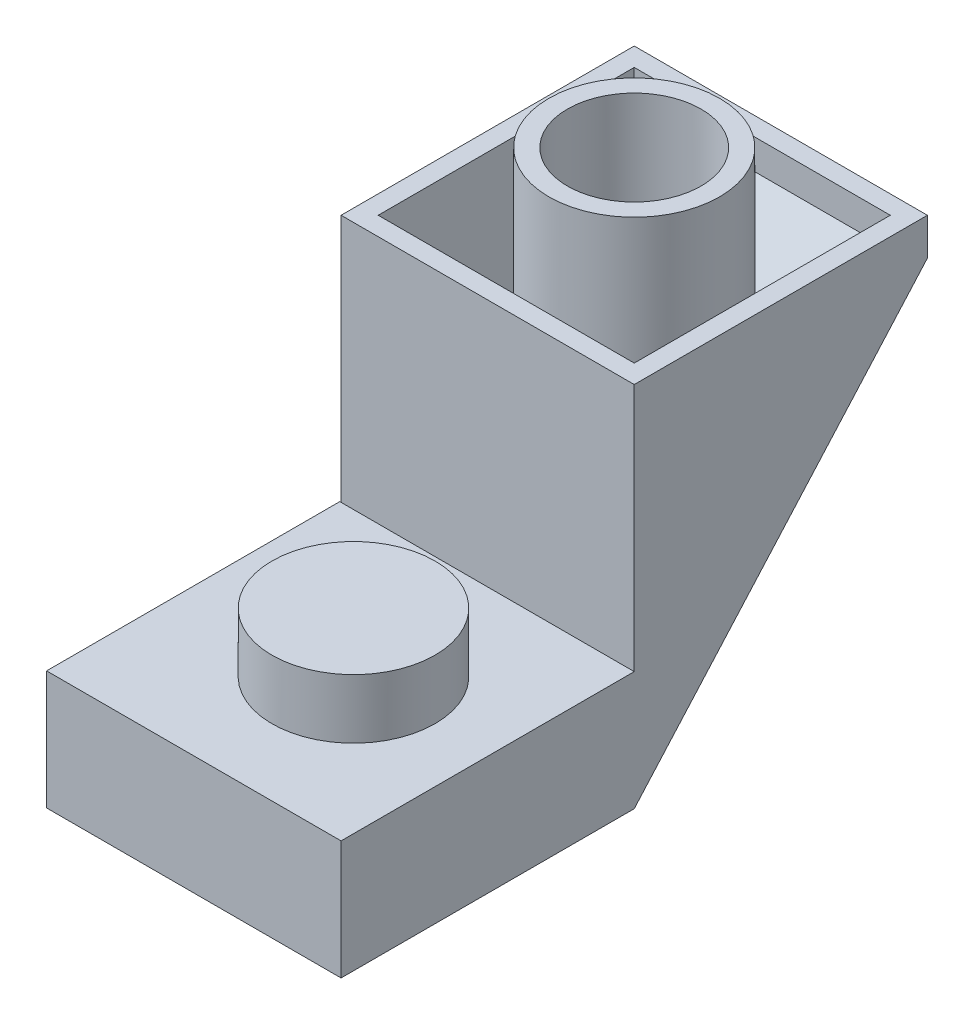
ISO-10303-21;
HEADER;
FILE_DESCRIPTION(('STEP AP214'),'2;1');
FILE_NAME('part.step','',(''),(''),'','','');
FILE_SCHEMA(('AUTOMOTIVE_DESIGN { 1 0 10303 214 1 1 1 1 }'));
ENDSEC;
DATA;
#1=APPLICATION_CONTEXT('core data for automotive mechanical design processes');
#2=APPLICATION_PROTOCOL_DEFINITION('international standard','automotive_design',2000,#1);
#3=PRODUCT_CONTEXT('',#1,'mechanical');
#4=PRODUCT('Part','Part','',(#3));
#5=PRODUCT_RELATED_PRODUCT_CATEGORY('part','',(#4));
#6=PRODUCT_DEFINITION_FORMATION('','',#4);
#7=PRODUCT_DEFINITION_CONTEXT('part definition',#1,'design');
#8=PRODUCT_DEFINITION('design','',#6,#7);
#9=PRODUCT_DEFINITION_SHAPE('','',#8);
#10=(LENGTH_UNIT() NAMED_UNIT(*) SI_UNIT(.MILLI.,.METRE.));
#11=(NAMED_UNIT(*) PLANE_ANGLE_UNIT() SI_UNIT($,.RADIAN.));
#12=(NAMED_UNIT(*) SI_UNIT($,.STERADIAN.) SOLID_ANGLE_UNIT());
#13=UNCERTAINTY_MEASURE_WITH_UNIT(LENGTH_MEASURE(1.E-05),#10,'distance_accuracy_value','');
#14=(GEOMETRIC_REPRESENTATION_CONTEXT(3) GLOBAL_UNCERTAINTY_ASSIGNED_CONTEXT((#13)) GLOBAL_UNIT_ASSIGNED_CONTEXT((#10,
#11,#12)) REPRESENTATION_CONTEXT('',''));
#15=CARTESIAN_POINT('',(0.,0.,0.));
#16=DIRECTION('',(0.,0.,1.));
#17=DIRECTION('',(1.,0.,0.));
#18=AXIS2_PLACEMENT_3D('',#15,#16,#17);
#19=CARTESIAN_POINT('',(-12.8193653307459,9.9,-7.9));
#20=DIRECTION('',(0.,1.,0.));
#21=DIRECTION('',(-1.,0.,0.));
#22=AXIS2_PLACEMENT_3D('',#19,#20,#21);
#23=PLANE('',#22);
#24=DIRECTION('',(0.,0.,1.));
#25=VECTOR('',#24,1.);
#26=CARTESIAN_POINT('',(-4.9193653307459,9.9,-7.9));
#27=LINE('',#26,#25);
#28=CARTESIAN_POINT('',(-4.9193653307459,9.9,-15.8));
#29=VERTEX_POINT('',#28);
#30=CARTESIAN_POINT('',(-4.9193653307459,9.9,-7.9));
#31=VERTEX_POINT('',#30);
#32=EDGE_CURVE('E369',#29,#31,#27,.T.);
#33=ORIENTED_EDGE('',*,*,#32,.F.);
#34=DIRECTION('',(1.,0.,0.));
#35=VECTOR('',#34,1.);
#36=CARTESIAN_POINT('',(-12.8193653307459,9.9,-15.8));
#37=LINE('',#36,#35);
#38=CARTESIAN_POINT('',(-12.8193653307459,9.9,-15.8));
#39=VERTEX_POINT('',#38);
#40=EDGE_CURVE('E377',#39,#29,#37,.T.);
#41=ORIENTED_EDGE('',*,*,#40,.F.);
#42=DIRECTION('',(0.,0.,1.));
#43=VECTOR('',#42,1.);
#44=CARTESIAN_POINT('',(-12.8193653307459,9.9,-7.9));
#45=LINE('',#44,#43);
#46=CARTESIAN_POINT('',(-12.8193653307459,9.9,-7.9));
#47=VERTEX_POINT('',#46);
#48=EDGE_CURVE('E360',#39,#47,#45,.T.);
#49=ORIENTED_EDGE('',*,*,#48,.T.);
#50=DIRECTION('',(1.,0.,0.));
#51=VECTOR('',#50,1.);
#52=CARTESIAN_POINT('',(-12.8193653307459,9.9,-7.9));
#53=LINE('',#52,#51);
#54=EDGE_CURVE('E374',#47,#31,#53,.T.);
#55=ORIENTED_EDGE('',*,*,#54,.T.);
#56=EDGE_LOOP('',(#33,#41,#49,#55));
#57=FACE_BOUND('',#56,.T.);
#58=DIRECTION('',(1.,0.,0.));
#59=VECTOR('',#58,1.);
#60=CARTESIAN_POINT('',(-12.8193653307459,9.9,-15.3));
#61=LINE('',#60,#59);
#62=CARTESIAN_POINT('',(-12.3193653307459,9.9,-15.3));
#63=VERTEX_POINT('',#62);
#64=CARTESIAN_POINT('',(-5.4193653307459,9.9,-15.3));
#65=VERTEX_POINT('',#64);
#66=EDGE_CURVE('E329',#63,#65,#61,.T.);
#67=ORIENTED_EDGE('',*,*,#66,.T.);
#68=DIRECTION('',(0.,0.,1.));
#69=VECTOR('',#68,1.);
#70=CARTESIAN_POINT('',(-5.4193653307459,9.9,-7.9));
#71=LINE('',#70,#69);
#72=CARTESIAN_POINT('',(-5.4193653307459,9.9,-8.4));
#73=VERTEX_POINT('',#72);
#74=EDGE_CURVE('E317',#65,#73,#71,.T.);
#75=ORIENTED_EDGE('',*,*,#74,.T.);
#76=DIRECTION('',(1.,0.,0.));
#77=VECTOR('',#76,1.);
#78=CARTESIAN_POINT('',(-12.8193653307459,9.9,-8.4));
#79=LINE('',#78,#77);
#80=CARTESIAN_POINT('',(-12.3193653307459,9.9,-8.4));
#81=VERTEX_POINT('',#80);
#82=EDGE_CURVE('E335',#81,#73,#79,.T.);
#83=ORIENTED_EDGE('',*,*,#82,.F.);
#84=DIRECTION('',(0.,0.,1.));
#85=VECTOR('',#84,1.);
#86=CARTESIAN_POINT('',(-12.3193653307459,9.9,-7.9));
#87=LINE('',#86,#85);
#88=EDGE_CURVE('E70',#63,#81,#87,.T.);
#89=ORIENTED_EDGE('',*,*,#88,.F.);
#90=EDGE_LOOP('',(#67,#75,#83,#89));
#91=FACE_BOUND('',#90,.T.);
#92=ADVANCED_FACE('F55',(#57,#91),#23,.T.);
#93=CARTESIAN_POINT('',(2.11527093596059,2.,-1.2));
#94=DIRECTION('',(0.,0.,-1.));
#95=DIRECTION('',(-1.,0.,0.));
#96=AXIS2_PLACEMENT_3D('',#93,#94,#95);
#97=PLANE('',#96);
#98=DIRECTION('',(1.,0.,0.));
#99=VECTOR('',#98,1.);
#100=CARTESIAN_POINT('',(2.11527093596059,2.,-1.2));
#101=LINE('',#100,#99);
#102=CARTESIAN_POINT('',(-11.2847290640394,2.,-1.2));
#103=VERTEX_POINT('',#102);
#104=CARTESIAN_POINT('',(-6.1193653307459,2.,-1.2));
#105=VERTEX_POINT('',#104);
#106=EDGE_CURVE('E415',#103,#105,#101,.T.);
#107=ORIENTED_EDGE('',*,*,#106,.T.);
#108=DIRECTION('',(0.,-1.,0.));
#109=VECTOR('',#108,1.);
#110=CARTESIAN_POINT('',(-6.1193653307459,2.,-1.2));
#111=LINE('',#110,#109);
#112=CARTESIAN_POINT('',(-6.1193653307459,0.,-1.2));
#113=VERTEX_POINT('',#112);
#114=EDGE_CURVE('E384',#105,#113,#111,.T.);
#115=ORIENTED_EDGE('',*,*,#114,.T.);
#116=DIRECTION('',(1.,0.,0.));
#117=VECTOR('',#116,1.);
#118=CARTESIAN_POINT('',(2.11527093596059,0.,-1.2));
#119=LINE('',#118,#117);
#120=CARTESIAN_POINT('',(-11.2847290640394,0.,-1.2));
#121=VERTEX_POINT('',#120);
#122=EDGE_CURVE('E420',#121,#113,#119,.T.);
#123=ORIENTED_EDGE('',*,*,#122,.F.);
#124=DIRECTION('',(0.,-1.,0.));
#125=VECTOR('',#124,1.);
#126=CARTESIAN_POINT('',(-11.2847290640394,2.,-1.2));
#127=LINE('',#126,#125);
#128=EDGE_CURVE('E412',#103,#121,#127,.T.);
#129=ORIENTED_EDGE('',*,*,#128,.F.);
#130=EDGE_LOOP('',(#107,#115,#123,#129));
#131=FACE_BOUND('',#130,.T.);
#132=ADVANCED_FACE('F57',(#131),#97,.T.);
#133=CARTESIAN_POINT('',(-11.2847290640394,3.2,7.9));
#134=DIRECTION('',(1.,0.,0.));
#135=DIRECTION('',(0.,0.,-1.));
#136=AXIS2_PLACEMENT_3D('',#133,#134,#135);
#137=PLANE('',#136);
#138=DIRECTION('',(0.,0.,-1.));
#139=VECTOR('',#138,1.);
#140=CARTESIAN_POINT('',(-11.2847290640394,2.,7.9));
#141=LINE('',#140,#139);
#142=CARTESIAN_POINT('',(-11.2847290640394,2.,-6.7));
#143=VERTEX_POINT('',#142);
#144=EDGE_CURVE('E425',#103,#143,#141,.T.);
#145=ORIENTED_EDGE('',*,*,#144,.F.);
#146=ORIENTED_EDGE('',*,*,#128,.T.);
#147=DIRECTION('',(0.,0.,-1.));
#148=VECTOR('',#147,1.);
#149=CARTESIAN_POINT('',(-11.2847290640394,0.,7.9));
#150=LINE('',#149,#148);
#151=CARTESIAN_POINT('',(-11.2847290640394,0.,-6.7));
#152=VERTEX_POINT('',#151);
#153=EDGE_CURVE('E436',#121,#152,#150,.T.);
#154=ORIENTED_EDGE('',*,*,#153,.T.);
#155=DIRECTION('',(0.,-1.,0.));
#156=VECTOR('',#155,1.);
#157=CARTESIAN_POINT('',(-11.2847290640394,3.2,-6.7));
#158=LINE('',#157,#156);
#159=EDGE_CURVE('E424',#143,#152,#158,.T.);
#160=ORIENTED_EDGE('',*,*,#159,.F.);
#161=EDGE_LOOP('',(#145,#146,#154,#160));
#162=FACE_BOUND('',#161,.T.);
#163=ADVANCED_FACE('F514',(#162),#137,.T.);
#164=CARTESIAN_POINT('',(0.,0.,-7.9));
#165=DIRECTION('',(0.,0.,1.));
#166=DIRECTION('',(1.,0.,0.));
#167=AXIS2_PLACEMENT_3D('',#164,#165,#166);
#168=PLANE('',#167);
#169=DIRECTION('',(-1.,0.,0.));
#170=VECTOR('',#169,1.);
#171=CARTESIAN_POINT('',(3.31527093596059,3.2,-7.9));
#172=LINE('',#171,#170);
#173=CARTESIAN_POINT('',(-12.8193653307459,3.2,-7.9));
#174=VERTEX_POINT('',#173);
#175=CARTESIAN_POINT('',(-12.8547290640394,3.2,-7.9));
#176=VERTEX_POINT('',#175);
#177=EDGE_CURVE('E445',#174,#176,#172,.T.);
#178=ORIENTED_EDGE('',*,*,#177,.F.);
#179=DIRECTION('',(0.,-1.,0.));
#180=VECTOR('',#179,1.);
#181=CARTESIAN_POINT('',(-12.8193653307459,0.,-7.9));
#182=LINE('',#181,#180);
#183=CARTESIAN_POINT('',(-12.8193653307459,0.,-7.9));
#184=VERTEX_POINT('',#183);
#185=EDGE_CURVE('E63',#174,#184,#182,.T.);
#186=ORIENTED_EDGE('',*,*,#185,.T.);
#187=DIRECTION('',(1.,0.,0.));
#188=VECTOR('',#187,1.);
#189=CARTESIAN_POINT('',(-12.4847290640394,0.,-7.9));
#190=LINE('',#189,#188);
#191=CARTESIAN_POINT('',(-12.8547290640394,0.,-7.9));
#192=VERTEX_POINT('',#191);
#193=EDGE_CURVE('E419',#192,#184,#190,.T.);
#194=ORIENTED_EDGE('',*,*,#193,.F.);
#195=DIRECTION('',(0.,1.,0.));
#196=VECTOR('',#195,1.);
#197=CARTESIAN_POINT('',(-12.8547290640394,0.,-7.9));
#198=LINE('',#197,#196);
#199=EDGE_CURVE('E393',#192,#176,#198,.T.);
#200=ORIENTED_EDGE('',*,*,#199,.T.);
#201=EDGE_LOOP('',(#178,#186,#194,#200));
#202=FACE_BOUND('',#201,.T.);
#203=ADVANCED_FACE('F459',(#202),#168,.F.);
#204=CARTESIAN_POINT('',(-12.4847290640394,0.,7.9));
#205=DIRECTION('',(0.,1.,0.));
#206=DIRECTION('',(0.,0.,1.));
#207=AXIS2_PLACEMENT_3D('',#204,#205,#206);
#208=PLANE('',#207);
#209=ORIENTED_EDGE('',*,*,#193,.T.);
#210=DIRECTION('',(1.,0.,0.));
#211=VECTOR('',#210,1.);
#212=CARTESIAN_POINT('',(-12.8193653307459,0.,-7.9));
#213=LINE('',#212,#211);
#214=CARTESIAN_POINT('',(-4.9193653307459,0.,-7.9));
#215=VERTEX_POINT('',#214);
#216=EDGE_CURVE('E363',#184,#215,#213,.T.);
#217=ORIENTED_EDGE('',*,*,#216,.T.);
#218=DIRECTION('',(0.,0.,1.));
#219=VECTOR('',#218,1.);
#220=CARTESIAN_POINT('',(-4.9193653307459,0.,7.9));
#221=LINE('',#220,#219);
#222=CARTESIAN_POINT('',(-4.9193653307459,0.,0.));
#223=VERTEX_POINT('',#222);
#224=EDGE_CURVE('E407',#215,#223,#221,.T.);
#225=ORIENTED_EDGE('',*,*,#224,.T.);
#226=DIRECTION('',(-1.,0.,0.));
#227=VECTOR('',#226,1.);
#228=CARTESIAN_POINT('',(-12.4847290640394,0.,0.));
#229=LINE('',#228,#227);
#230=CARTESIAN_POINT('',(-12.8547290640394,0.,0.));
#231=VERTEX_POINT('',#230);
#232=EDGE_CURVE('E417',#223,#231,#229,.T.);
#233=ORIENTED_EDGE('',*,*,#232,.T.);
#234=DIRECTION('',(0.,0.,1.));
#235=VECTOR('',#234,1.);
#236=CARTESIAN_POINT('',(-12.8547290640394,0.,-7.9));
#237=LINE('',#236,#235);
#238=EDGE_CURVE('E390',#192,#231,#237,.T.);
#239=ORIENTED_EDGE('',*,*,#238,.F.);
#240=EDGE_LOOP('',(#209,#217,#225,#233,#239));
#241=FACE_BOUND('',#240,.T.);
#242=DIRECTION('',(0.,0.,-1.));
#243=VECTOR('',#242,1.);
#244=CARTESIAN_POINT('',(-6.11936533074589,0.,-6.7));
#245=LINE('',#244,#243);
#246=CARTESIAN_POINT('',(-6.11936533074589,0.,-6.7));
#247=VERTEX_POINT('',#246);
#248=EDGE_CURVE('E385',#113,#247,#245,.T.);
#249=ORIENTED_EDGE('',*,*,#248,.T.);
#250=DIRECTION('',(1.,0.,0.));
#251=VECTOR('',#250,1.);
#252=CARTESIAN_POINT('',(-12.4847290640394,0.,-6.7));
#253=LINE('',#252,#251);
#254=EDGE_CURVE('E428',#152,#247,#253,.T.);
#255=ORIENTED_EDGE('',*,*,#254,.F.);
#256=ORIENTED_EDGE('',*,*,#153,.F.);
#257=ORIENTED_EDGE('',*,*,#122,.T.);
#258=EDGE_LOOP('',(#249,#255,#256,#257));
#259=FACE_BOUND('',#258,.T.);
#260=ADVANCED_FACE('F462',(#241,#259),#208,.F.);
#261=CARTESIAN_POINT('',(3.31527093596059,3.2,7.9));
#262=DIRECTION('',(0.,-1.,0.));
#263=DIRECTION('',(1.,0.,0.));
#264=AXIS2_PLACEMENT_3D('',#261,#262,#263);
#265=PLANE('',#264);
#266=DIRECTION('',(0.,0.,-1.));
#267=VECTOR('',#266,1.);
#268=CARTESIAN_POINT('',(-4.9193653307459,3.2,7.9));
#269=LINE('',#268,#267);
#270=CARTESIAN_POINT('',(-4.9193653307459,3.2,0.));
#271=VERTEX_POINT('',#270);
#272=CARTESIAN_POINT('',(-4.9193653307459,3.2,-7.9));
#273=VERTEX_POINT('',#272);
#274=EDGE_CURVE('E409',#271,#273,#269,.T.);
#275=ORIENTED_EDGE('',*,*,#274,.T.);
#276=EDGE_CURVE('E446',#273,#174,#172,.T.);
#277=ORIENTED_EDGE('',*,*,#276,.T.);
#278=ORIENTED_EDGE('',*,*,#177,.T.);
#279=DIRECTION('',(0.,0.,1.));
#280=VECTOR('',#279,1.);
#281=CARTESIAN_POINT('',(-12.8547290640394,3.2,-7.9));
#282=LINE('',#281,#280);
#283=CARTESIAN_POINT('',(-12.8547290640394,3.2,0.));
#284=VERTEX_POINT('',#283);
#285=EDGE_CURVE('E396',#176,#284,#282,.T.);
#286=ORIENTED_EDGE('',*,*,#285,.T.);
#287=DIRECTION('',(-1.,0.,0.));
#288=VECTOR('',#287,1.);
#289=CARTESIAN_POINT('',(-12.4847290640394,3.2,0.));
#290=LINE('',#289,#288);
#291=EDGE_CURVE('E413',#271,#284,#290,.T.);
#292=ORIENTED_EDGE('',*,*,#291,.F.);
#293=EDGE_LOOP('',(#275,#277,#278,#286,#292));
#294=FACE_BOUND('',#293,.T.);
#295=CARTESIAN_POINT('',(-8.58472906403941,3.2,-4.));
#296=DIRECTION('',(0.,-1.,0.));
#297=DIRECTION('',(1.,0.,0.));
#298=AXIS2_PLACEMENT_3D('',#295,#296,#297);
#299=CIRCLE('',#298,2.19793866498286);
#300=CARTESIAN_POINT('',(-6.38679039905655,3.2,-4.));
#301=VERTEX_POINT('',#300);
#302=EDGE_CURVE('E442',#301,#301,#299,.F.);
#303=ORIENTED_EDGE('',*,*,#302,.F.);
#304=EDGE_LOOP('',(#303));
#305=FACE_BOUND('',#304,.T.);
#306=ADVANCED_FACE('F473',(#294,#305),#265,.F.);
#307=CARTESIAN_POINT('',(-8.58472906403941,4.8,-4.));
#308=DIRECTION('',(0.,-1.,0.));
#309=DIRECTION('',(1.,0.,0.));
#310=AXIS2_PLACEMENT_3D('',#307,#308,#309);
#311=CYLINDRICAL_SURFACE('',#310,2.19793866498286);
#312=CARTESIAN_POINT('',(-8.58472906403941,4.8,-4.));
#313=DIRECTION('',(0.,1.,0.));
#314=DIRECTION('',(-1.,0.,0.));
#315=AXIS2_PLACEMENT_3D('',#312,#313,#314);
#316=CIRCLE('',#315,2.19793866498286);
#317=CARTESIAN_POINT('',(-10.7826677290223,4.8,-4.));
#318=VERTEX_POINT('',#317);
#319=EDGE_CURVE('E431',#318,#318,#316,.T.);
#320=ORIENTED_EDGE('',*,*,#319,.F.);
#321=EDGE_LOOP('',(#320));
#322=FACE_BOUND('',#321,.T.);
#323=ORIENTED_EDGE('',*,*,#302,.T.);
#324=EDGE_LOOP('',(#323));
#325=FACE_BOUND('',#324,.T.);
#326=ADVANCED_FACE('F583',(#322,#325),#311,.T.);
#327=CARTESIAN_POINT('',(-8.58472906403941,4.8,-4.));
#328=DIRECTION('',(0.,1.,0.));
#329=DIRECTION('',(-1.,0.,0.));
#330=AXIS2_PLACEMENT_3D('',#327,#328,#329);
#331=PLANE('',#330);
#332=ORIENTED_EDGE('',*,*,#319,.T.);
#333=EDGE_LOOP('',(#332));
#334=FACE_BOUND('',#333,.T.);
#335=ADVANCED_FACE('F542',(#334),#331,.T.);
#336=CARTESIAN_POINT('',(3.31527093596059,2.,7.9));
#337=DIRECTION('',(0.,-1.,0.));
#338=DIRECTION('',(1.,0.,0.));
#339=AXIS2_PLACEMENT_3D('',#336,#337,#338);
#340=PLANE('',#339);
#341=DIRECTION('',(0.,0.,-1.));
#342=VECTOR('',#341,1.);
#343=CARTESIAN_POINT('',(-6.11936533074589,2.,-6.7));
#344=LINE('',#343,#342);
#345=CARTESIAN_POINT('',(-6.11936533074589,2.,-6.7));
#346=VERTEX_POINT('',#345);
#347=EDGE_CURVE('E376',#105,#346,#344,.T.);
#348=ORIENTED_EDGE('',*,*,#347,.F.);
#349=ORIENTED_EDGE('',*,*,#106,.F.);
#350=ORIENTED_EDGE('',*,*,#144,.T.);
#351=DIRECTION('',(-1.,0.,0.));
#352=VECTOR('',#351,1.);
#353=CARTESIAN_POINT('',(3.31527093596059,2.,-6.7));
#354=LINE('',#353,#352);
#355=EDGE_CURVE('E426',#346,#143,#354,.T.);
#356=ORIENTED_EDGE('',*,*,#355,.F.);
#357=EDGE_LOOP('',(#348,#349,#350,#356));
#358=FACE_BOUND('',#357,.T.);
#359=CARTESIAN_POINT('',(-8.58472906403941,2.,-4.));
#360=DIRECTION('',(0.,-1.,0.));
#361=DIRECTION('',(1.,0.,0.));
#362=AXIS2_PLACEMENT_3D('',#359,#360,#361);
#363=CIRCLE('',#362,0.997938664982861);
#364=CARTESIAN_POINT('',(-7.58679039905655,2.,-4.));
#365=VERTEX_POINT('',#364);
#366=EDGE_CURVE('E421',#365,#365,#363,.F.);
#367=ORIENTED_EDGE('',*,*,#366,.T.);
#368=EDGE_LOOP('',(#367));
#369=FACE_BOUND('',#368,.T.);
#370=ADVANCED_FACE('F537',(#358,#369),#340,.T.);
#371=CARTESIAN_POINT('',(0.,0.,-6.7));
#372=DIRECTION('',(0.,0.,1.));
#373=DIRECTION('',(1.,0.,0.));
#374=AXIS2_PLACEMENT_3D('',#371,#372,#373);
#375=PLANE('',#374);
#376=DIRECTION('',(0.,-1.,0.));
#377=VECTOR('',#376,1.);
#378=CARTESIAN_POINT('',(-6.11936533074589,2.,-6.7));
#379=LINE('',#378,#377);
#380=EDGE_CURVE('E387',#346,#247,#379,.T.);
#381=ORIENTED_EDGE('',*,*,#380,.F.);
#382=ORIENTED_EDGE('',*,*,#355,.T.);
#383=ORIENTED_EDGE('',*,*,#159,.T.);
#384=ORIENTED_EDGE('',*,*,#254,.T.);
#385=EDGE_LOOP('',(#381,#382,#383,#384));
#386=FACE_BOUND('',#385,.T.);
#387=ADVANCED_FACE('F541',(#386),#375,.T.);
#388=CARTESIAN_POINT('',(-8.58472906403941,4.8,-4.));
#389=DIRECTION('',(0.,-1.,0.));
#390=DIRECTION('',(1.,0.,0.));
#391=AXIS2_PLACEMENT_3D('',#388,#389,#390);
#392=CYLINDRICAL_SURFACE('',#391,0.997938664982861);
#393=CARTESIAN_POINT('',(-8.58472906403941,3.6,-4.));
#394=DIRECTION('',(0.,1.,0.));
#395=DIRECTION('',(-1.,0.,0.));
#396=AXIS2_PLACEMENT_3D('',#393,#394,#395);
#397=CIRCLE('',#396,0.997938664982861);
#398=CARTESIAN_POINT('',(-9.58266772902228,3.6,-4.));
#399=VERTEX_POINT('',#398);
#400=EDGE_CURVE('E416',#399,#399,#397,.T.);
#401=ORIENTED_EDGE('',*,*,#400,.T.);
#402=EDGE_LOOP('',(#401));
#403=FACE_BOUND('',#402,.T.);
#404=ORIENTED_EDGE('',*,*,#366,.F.);
#405=EDGE_LOOP('',(#404));
#406=FACE_BOUND('',#405,.T.);
#407=ADVANCED_FACE('F503',(#403,#406),#392,.F.);
#408=CARTESIAN_POINT('',(-8.58472906403941,3.6,-4.));
#409=DIRECTION('',(0.,1.,0.));
#410=DIRECTION('',(-1.,0.,0.));
#411=AXIS2_PLACEMENT_3D('',#408,#409,#410);
#412=PLANE('',#411);
#413=ORIENTED_EDGE('',*,*,#400,.F.);
#414=EDGE_LOOP('',(#413));
#415=FACE_BOUND('',#414,.T.);
#416=ADVANCED_FACE('F495',(#415),#412,.F.);
#417=CARTESIAN_POINT('',(-12.4847290640394,-0.386249267544194,0.));
#418=DIRECTION('',(0.,0.,-1.));
#419=DIRECTION('',(-1.,0.,0.));
#420=AXIS2_PLACEMENT_3D('',#417,#418,#419);
#421=PLANE('',#420);
#422=ORIENTED_EDGE('',*,*,#232,.F.);
#423=DIRECTION('',(0.,1.,0.));
#424=VECTOR('',#423,1.);
#425=CARTESIAN_POINT('',(-4.9193653307459,-0.277831155568587,0.));
#426=LINE('',#425,#424);
#427=EDGE_CURVE('E404',#223,#271,#426,.T.);
#428=ORIENTED_EDGE('',*,*,#427,.T.);
#429=ORIENTED_EDGE('',*,*,#291,.T.);
#430=DIRECTION('',(0.,1.,0.));
#431=VECTOR('',#430,1.);
#432=CARTESIAN_POINT('',(-12.8547290640394,0.,0.));
#433=LINE('',#432,#431);
#434=EDGE_CURVE('E401',#231,#284,#433,.T.);
#435=ORIENTED_EDGE('',*,*,#434,.F.);
#436=EDGE_LOOP('',(#422,#428,#429,#435));
#437=FACE_BOUND('',#436,.T.);
#438=ADVANCED_FACE('F493',(#437),#421,.F.);
#439=CARTESIAN_POINT('',(-4.9193653307459,-0.277831155568587,-7.9));
#440=DIRECTION('',(-1.,0.,0.));
#441=DIRECTION('',(0.,-1.,0.));
#442=AXIS2_PLACEMENT_3D('',#439,#440,#441);
#443=PLANE('',#442);
#444=ORIENTED_EDGE('',*,*,#427,.F.);
#445=ORIENTED_EDGE('',*,*,#224,.F.);
#446=DIRECTION('',(0.,0.74787275405863,-0.663842107535188));
#447=VECTOR('',#446,1.);
#448=CARTESIAN_POINT('',(-4.9193653307459,0.,-7.9));
#449=LINE('',#448,#447);
#450=CARTESIAN_POINT('',(-4.9193653307459,8.9,-15.8));
#451=VERTEX_POINT('',#450);
#452=EDGE_CURVE('E345',#215,#451,#449,.T.);
#453=ORIENTED_EDGE('',*,*,#452,.T.);
#454=DIRECTION('',(0.,1.,0.));
#455=VECTOR('',#454,1.);
#456=CARTESIAN_POINT('',(-4.9193653307459,9.9,-15.8));
#457=LINE('',#456,#455);
#458=EDGE_CURVE('E366',#451,#29,#457,.T.);
#459=ORIENTED_EDGE('',*,*,#458,.T.);
#460=ORIENTED_EDGE('',*,*,#32,.T.);
#461=DIRECTION('',(0.,-1.,0.));
#462=VECTOR('',#461,1.);
#463=CARTESIAN_POINT('',(-4.9193653307459,3.2,-7.9));
#464=LINE('',#463,#462);
#465=EDGE_CURVE('E355',#31,#273,#464,.T.);
#466=ORIENTED_EDGE('',*,*,#465,.T.);
#467=ORIENTED_EDGE('',*,*,#274,.F.);
#468=EDGE_LOOP('',(#444,#445,#453,#459,#460,#466,#467));
#469=FACE_BOUND('',#468,.T.);
#470=ADVANCED_FACE('F481',(#469),#443,.F.);
#471=CARTESIAN_POINT('',(-12.8547290640394,0.,-7.9));
#472=DIRECTION('',(-1.,0.,0.));
#473=DIRECTION('',(0.,-1.,0.));
#474=AXIS2_PLACEMENT_3D('',#471,#472,#473);
#475=PLANE('',#474);
#476=ORIENTED_EDGE('',*,*,#434,.T.);
#477=ORIENTED_EDGE('',*,*,#285,.F.);
#478=ORIENTED_EDGE('',*,*,#199,.F.);
#479=ORIENTED_EDGE('',*,*,#238,.T.);
#480=EDGE_LOOP('',(#476,#477,#478,#479));
#481=FACE_BOUND('',#480,.T.);
#482=ADVANCED_FACE('F470',(#481),#475,.T.);
#483=CARTESIAN_POINT('',(-6.11936533074589,2.,-6.7));
#484=DIRECTION('',(-1.,0.,0.));
#485=DIRECTION('',(0.,-1.,0.));
#486=AXIS2_PLACEMENT_3D('',#483,#484,#485);
#487=PLANE('',#486);
#488=ORIENTED_EDGE('',*,*,#380,.T.);
#489=ORIENTED_EDGE('',*,*,#248,.F.);
#490=ORIENTED_EDGE('',*,*,#114,.F.);
#491=ORIENTED_EDGE('',*,*,#347,.T.);
#492=EDGE_LOOP('',(#488,#489,#490,#491));
#493=FACE_BOUND('',#492,.T.);
#494=ADVANCED_FACE('F522',(#493),#487,.T.);
#495=CARTESIAN_POINT('',(-12.8193653307459,3.2,-7.9));
#496=DIRECTION('',(0.,0.,1.));
#497=DIRECTION('',(1.,0.,0.));
#498=AXIS2_PLACEMENT_3D('',#495,#496,#497);
#499=PLANE('',#498);
#500=ORIENTED_EDGE('',*,*,#276,.F.);
#501=ORIENTED_EDGE('',*,*,#465,.F.);
#502=ORIENTED_EDGE('',*,*,#54,.F.);
#503=EDGE_CURVE('E352',#47,#174,#182,.T.);
#504=ORIENTED_EDGE('',*,*,#503,.T.);
#505=EDGE_LOOP('',(#500,#501,#502,#504));
#506=FACE_BOUND('',#505,.T.);
#507=ADVANCED_FACE('F477',(#506),#499,.T.);
#508=CARTESIAN_POINT('',(-12.8193653307459,9.9,-15.8));
#509=DIRECTION('',(0.,0.,-1.));
#510=DIRECTION('',(-1.,0.,0.));
#511=AXIS2_PLACEMENT_3D('',#508,#509,#510);
#512=PLANE('',#511);
#513=ORIENTED_EDGE('',*,*,#458,.F.);
#514=DIRECTION('',(1.,0.,0.));
#515=VECTOR('',#514,1.);
#516=CARTESIAN_POINT('',(-12.8193653307459,8.9,-15.8));
#517=LINE('',#516,#515);
#518=CARTESIAN_POINT('',(-12.8193653307459,8.9,-15.8));
#519=VERTEX_POINT('',#518);
#520=EDGE_CURVE('E379',#519,#451,#517,.T.);
#521=ORIENTED_EDGE('',*,*,#520,.F.);
#522=DIRECTION('',(0.,1.,0.));
#523=VECTOR('',#522,1.);
#524=CARTESIAN_POINT('',(-12.8193653307459,9.9,-15.8));
#525=LINE('',#524,#523);
#526=EDGE_CURVE('E357',#519,#39,#525,.T.);
#527=ORIENTED_EDGE('',*,*,#526,.T.);
#528=ORIENTED_EDGE('',*,*,#40,.T.);
#529=EDGE_LOOP('',(#513,#521,#527,#528));
#530=FACE_BOUND('',#529,.T.);
#531=ADVANCED_FACE('F489',(#530),#512,.T.);
#532=CARTESIAN_POINT('',(-12.8193653307459,0.,-7.9));
#533=DIRECTION('',(0.,-0.663842107535188,-0.74787275405863));
#534=DIRECTION('',(0.,0.74787275405863,-0.663842107535188));
#535=AXIS2_PLACEMENT_3D('',#532,#533,#534);
#536=PLANE('',#535);
#537=ORIENTED_EDGE('',*,*,#452,.F.);
#538=ORIENTED_EDGE('',*,*,#216,.F.);
#539=DIRECTION('',(0.,0.74787275405863,-0.663842107535188));
#540=VECTOR('',#539,1.);
#541=CARTESIAN_POINT('',(-12.8193653307459,0.,-7.9));
#542=LINE('',#541,#540);
#543=EDGE_CURVE('E78',#184,#519,#542,.T.);
#544=ORIENTED_EDGE('',*,*,#543,.T.);
#545=ORIENTED_EDGE('',*,*,#520,.T.);
#546=EDGE_LOOP('',(#537,#538,#544,#545));
#547=FACE_BOUND('',#546,.T.);
#548=ADVANCED_FACE('F491',(#547),#536,.T.);
#549=CARTESIAN_POINT('',(-12.8193653307459,0.,0.));
#550=DIRECTION('',(-1.,0.,0.));
#551=DIRECTION('',(0.,-1.,0.));
#552=AXIS2_PLACEMENT_3D('',#549,#550,#551);
#553=PLANE('',#552);
#554=ORIENTED_EDGE('',*,*,#503,.F.);
#555=ORIENTED_EDGE('',*,*,#48,.F.);
#556=ORIENTED_EDGE('',*,*,#526,.F.);
#557=ORIENTED_EDGE('',*,*,#543,.F.);
#558=ORIENTED_EDGE('',*,*,#185,.F.);
#559=EDGE_LOOP('',(#554,#555,#556,#557,#558));
#560=FACE_BOUND('',#559,.T.);
#561=ADVANCED_FACE('F487',(#560),#553,.T.);
#562=CARTESIAN_POINT('',(2.11527093596059,2.,-0.7));
#563=DIRECTION('',(0.,0.,-1.));
#564=DIRECTION('',(-1.,0.,0.));
#565=AXIS2_PLACEMENT_3D('',#562,#563,#564);
#566=PLANE('',#565);
#567=DIRECTION('',(1.,0.,0.));
#568=VECTOR('',#567,1.);
#569=CARTESIAN_POINT('',(3.31527093596059,2.5,-0.699999999999999));
#570=LINE('',#569,#568);
#571=CARTESIAN_POINT('',(-11.7847290640394,2.5,-0.7));
#572=VERTEX_POINT('',#571);
#573=CARTESIAN_POINT('',(-5.6193653307459,2.5,-0.7));
#574=VERTEX_POINT('',#573);
#575=EDGE_CURVE('E224',#572,#574,#570,.T.);
#576=ORIENTED_EDGE('',*,*,#575,.F.);
#577=DIRECTION('',(0.,-1.,0.));
#578=VECTOR('',#577,1.);
#579=CARTESIAN_POINT('',(-11.7847290640394,2.,-0.7));
#580=LINE('',#579,#578);
#581=CARTESIAN_POINT('',(-11.7847290640394,0.5,-0.7));
#582=VERTEX_POINT('',#581);
#583=EDGE_CURVE('E229',#572,#582,#580,.T.);
#584=ORIENTED_EDGE('',*,*,#583,.T.);
#585=DIRECTION('',(1.,0.,0.));
#586=VECTOR('',#585,1.);
#587=CARTESIAN_POINT('',(2.11527093596059,0.5,-0.7));
#588=LINE('',#587,#586);
#589=CARTESIAN_POINT('',(-5.6193653307459,0.5,-0.7));
#590=VERTEX_POINT('',#589);
#591=EDGE_CURVE('E255',#582,#590,#588,.T.);
#592=ORIENTED_EDGE('',*,*,#591,.T.);
#593=DIRECTION('',(0.,-1.,0.));
#594=VECTOR('',#593,1.);
#595=CARTESIAN_POINT('',(-5.6193653307459,2.,-0.7));
#596=LINE('',#595,#594);
#597=EDGE_CURVE('E232',#574,#590,#596,.T.);
#598=ORIENTED_EDGE('',*,*,#597,.F.);
#599=EDGE_LOOP('',(#576,#584,#592,#598));
#600=FACE_BOUND('',#599,.T.);
#601=ADVANCED_FACE('F226',(#600),#566,.F.);
#602=CARTESIAN_POINT('',(-11.7847290640394,3.2,7.9));
#603=DIRECTION('',(1.,0.,0.));
#604=DIRECTION('',(0.,0.,-1.));
#605=AXIS2_PLACEMENT_3D('',#602,#603,#604);
#606=PLANE('',#605);
#607=DIRECTION('',(0.,0.,-1.));
#608=VECTOR('',#607,1.);
#609=CARTESIAN_POINT('',(-11.7847290640394,2.5,7.9));
#610=LINE('',#609,#608);
#611=CARTESIAN_POINT('',(-11.7847290640394,2.5,-7.2));
#612=VERTEX_POINT('',#611);
#613=EDGE_CURVE('E239',#572,#612,#610,.T.);
#614=ORIENTED_EDGE('',*,*,#613,.T.);
#615=DIRECTION('',(0.,-1.,0.));
#616=VECTOR('',#615,1.);
#617=CARTESIAN_POINT('',(-11.7847290640394,3.2,-7.2));
#618=LINE('',#617,#616);
#619=CARTESIAN_POINT('',(-11.7847290640394,0.5,-7.2));
#620=VERTEX_POINT('',#619);
#621=EDGE_CURVE('E263',#612,#620,#618,.T.);
#622=ORIENTED_EDGE('',*,*,#621,.T.);
#623=DIRECTION('',(0.,0.,-1.));
#624=VECTOR('',#623,1.);
#625=CARTESIAN_POINT('',(-11.7847290640394,0.5,7.9));
#626=LINE('',#625,#624);
#627=EDGE_CURVE('E251',#582,#620,#626,.T.);
#628=ORIENTED_EDGE('',*,*,#627,.F.);
#629=ORIENTED_EDGE('',*,*,#583,.F.);
#630=EDGE_LOOP('',(#614,#622,#628,#629));
#631=FACE_BOUND('',#630,.T.);
#632=ADVANCED_FACE('F250',(#631),#606,.F.);
#633=CARTESIAN_POINT('',(0.,0.,-7.4));
#634=DIRECTION('',(0.,0.,1.));
#635=DIRECTION('',(1.,0.,0.));
#636=AXIS2_PLACEMENT_3D('',#633,#634,#635);
#637=PLANE('',#636);
#638=DIRECTION('',(-1.,0.,0.));
#639=VECTOR('',#638,1.);
#640=CARTESIAN_POINT('',(3.31527093596059,2.7,-7.4));
#641=LINE('',#640,#639);
#642=CARTESIAN_POINT('',(-12.3193653307459,2.7,-7.4));
#643=VERTEX_POINT('',#642);
#644=CARTESIAN_POINT('',(-12.3547290640394,2.7,-7.4));
#645=VERTEX_POINT('',#644);
#646=EDGE_CURVE('E269',#643,#645,#641,.T.);
#647=ORIENTED_EDGE('',*,*,#646,.T.);
#648=DIRECTION('',(0.,1.,0.));
#649=VECTOR('',#648,1.);
#650=CARTESIAN_POINT('',(-12.3547290640394,0.,-7.4));
#651=LINE('',#650,#649);
#652=CARTESIAN_POINT('',(-12.3547290640394,0.5,-7.4));
#653=VERTEX_POINT('',#652);
#654=EDGE_CURVE('E281',#653,#645,#651,.T.);
#655=ORIENTED_EDGE('',*,*,#654,.F.);
#656=DIRECTION('',(1.,0.,0.));
#657=VECTOR('',#656,1.);
#658=CARTESIAN_POINT('',(-12.4847290640394,0.5,-7.4));
#659=LINE('',#658,#657);
#660=CARTESIAN_POINT('',(-12.3193653307459,0.5,-7.4));
#661=VERTEX_POINT('',#660);
#662=EDGE_CURVE('E266',#653,#661,#659,.T.);
#663=ORIENTED_EDGE('',*,*,#662,.T.);
#664=DIRECTION('',(0.,-1.,0.));
#665=VECTOR('',#664,1.);
#666=CARTESIAN_POINT('',(-12.3193653307459,0.,-7.4));
#667=LINE('',#666,#665);
#668=EDGE_CURVE('E235',#643,#661,#667,.T.);
#669=ORIENTED_EDGE('',*,*,#668,.F.);
#670=EDGE_LOOP('',(#647,#655,#663,#669));
#671=FACE_BOUND('',#670,.T.);
#672=ADVANCED_FACE('F631',(#671),#637,.T.);
#673=CARTESIAN_POINT('',(-12.4847290640394,0.5,7.9));
#674=DIRECTION('',(0.,1.,0.));
#675=DIRECTION('',(0.,0.,1.));
#676=AXIS2_PLACEMENT_3D('',#673,#674,#675);
#677=PLANE('',#676);
#678=ORIENTED_EDGE('',*,*,#662,.F.);
#679=DIRECTION('',(0.,0.,1.));
#680=VECTOR('',#679,1.);
#681=CARTESIAN_POINT('',(-12.3547290640394,0.5,7.9));
#682=LINE('',#681,#680);
#683=CARTESIAN_POINT('',(-12.3547290640394,0.5,-0.5));
#684=VERTEX_POINT('',#683);
#685=EDGE_CURVE('E278',#653,#684,#682,.T.);
#686=ORIENTED_EDGE('',*,*,#685,.T.);
#687=DIRECTION('',(-1.,0.,0.));
#688=VECTOR('',#687,1.);
#689=CARTESIAN_POINT('',(-12.4847290640394,0.5,-0.5));
#690=LINE('',#689,#688);
#691=CARTESIAN_POINT('',(-5.4193653307459,0.5,-0.5));
#692=VERTEX_POINT('',#691);
#693=EDGE_CURVE('E270',#692,#684,#690,.T.);
#694=ORIENTED_EDGE('',*,*,#693,.F.);
#695=DIRECTION('',(0.,0.,1.));
#696=VECTOR('',#695,1.);
#697=CARTESIAN_POINT('',(-5.4193653307459,0.5,7.9));
#698=LINE('',#697,#696);
#699=CARTESIAN_POINT('',(-5.4193653307459,0.5,-7.67525729434552));
#700=VERTEX_POINT('',#699);
#701=EDGE_CURVE('E258',#700,#692,#698,.T.);
#702=ORIENTED_EDGE('',*,*,#701,.F.);
#703=DIRECTION('',(1.,0.,0.));
#704=VECTOR('',#703,1.);
#705=CARTESIAN_POINT('',(-12.8193653307459,0.5,-7.67525729434552));
#706=LINE('',#705,#704);
#707=CARTESIAN_POINT('',(-12.3193653307459,0.5,-7.67525729434552));
#708=VERTEX_POINT('',#707);
#709=EDGE_CURVE('E271',#708,#700,#706,.T.);
#710=ORIENTED_EDGE('',*,*,#709,.F.);
#711=DIRECTION('',(0.,0.,-1.));
#712=VECTOR('',#711,1.);
#713=CARTESIAN_POINT('',(-12.3193653307459,0.5,0.));
#714=LINE('',#713,#712);
#715=EDGE_CURVE('E342',#661,#708,#714,.T.);
#716=ORIENTED_EDGE('',*,*,#715,.F.);
#717=EDGE_LOOP('',(#678,#686,#694,#702,#710,#716));
#718=FACE_BOUND('',#717,.T.);
#719=DIRECTION('',(0.,0.,-1.));
#720=VECTOR('',#719,1.);
#721=CARTESIAN_POINT('',(-5.6193653307459,0.5,-6.7));
#722=LINE('',#721,#720);
#723=CARTESIAN_POINT('',(-5.6193653307459,0.5,-7.2));
#724=VERTEX_POINT('',#723);
#725=EDGE_CURVE('E283',#590,#724,#722,.T.);
#726=ORIENTED_EDGE('',*,*,#725,.F.);
#727=ORIENTED_EDGE('',*,*,#591,.F.);
#728=ORIENTED_EDGE('',*,*,#627,.T.);
#729=DIRECTION('',(1.,0.,0.));
#730=VECTOR('',#729,1.);
#731=CARTESIAN_POINT('',(-12.4847290640394,0.5,-7.2));
#732=LINE('',#731,#730);
#733=EDGE_CURVE('E265',#620,#724,#732,.T.);
#734=ORIENTED_EDGE('',*,*,#733,.T.);
#735=EDGE_LOOP('',(#726,#727,#728,#734));
#736=FACE_BOUND('',#735,.T.);
#737=ADVANCED_FACE('F640',(#718,#736),#677,.T.);
#738=CARTESIAN_POINT('',(3.31527093596059,2.7,7.9));
#739=DIRECTION('',(0.,-1.,0.));
#740=DIRECTION('',(1.,0.,0.));
#741=AXIS2_PLACEMENT_3D('',#738,#739,#740);
#742=PLANE('',#741);
#743=DIRECTION('',(0.,0.,-1.));
#744=VECTOR('',#743,1.);
#745=CARTESIAN_POINT('',(-5.4193653307459,2.7,7.9));
#746=LINE('',#745,#744);
#747=CARTESIAN_POINT('',(-5.4193653307459,2.7,-0.5));
#748=VERTEX_POINT('',#747);
#749=CARTESIAN_POINT('',(-5.4193653307459,2.7,-8.4));
#750=VERTEX_POINT('',#749);
#751=EDGE_CURVE('E253',#748,#750,#746,.T.);
#752=ORIENTED_EDGE('',*,*,#751,.F.);
#753=DIRECTION('',(-1.,0.,0.));
#754=VECTOR('',#753,1.);
#755=CARTESIAN_POINT('',(-12.4847290640394,2.7,-0.5));
#756=LINE('',#755,#754);
#757=CARTESIAN_POINT('',(-12.3547290640394,2.7,-0.5));
#758=VERTEX_POINT('',#757);
#759=EDGE_CURVE('E236',#748,#758,#756,.T.);
#760=ORIENTED_EDGE('',*,*,#759,.T.);
#761=DIRECTION('',(0.,0.,1.));
#762=VECTOR('',#761,1.);
#763=CARTESIAN_POINT('',(-12.3547290640394,2.7,-7.9));
#764=LINE('',#763,#762);
#765=EDGE_CURVE('E293',#645,#758,#764,.T.);
#766=ORIENTED_EDGE('',*,*,#765,.F.);
#767=ORIENTED_EDGE('',*,*,#646,.F.);
#768=DIRECTION('',(0.,0.,-1.));
#769=VECTOR('',#768,1.);
#770=CARTESIAN_POINT('',(-12.3193653307459,2.7,7.9));
#771=LINE('',#770,#769);
#772=CARTESIAN_POINT('',(-12.3193653307459,2.7,-8.4));
#773=VERTEX_POINT('',#772);
#774=EDGE_CURVE('E291',#643,#773,#771,.T.);
#775=ORIENTED_EDGE('',*,*,#774,.T.);
#776=DIRECTION('',(-1.,0.,0.));
#777=VECTOR('',#776,1.);
#778=CARTESIAN_POINT('',(3.31527093596059,2.7,-8.4));
#779=LINE('',#778,#777);
#780=EDGE_CURVE('E288',#750,#773,#779,.T.);
#781=ORIENTED_EDGE('',*,*,#780,.F.);
#782=EDGE_LOOP('',(#752,#760,#766,#767,#775,#781));
#783=FACE_BOUND('',#782,.T.);
#784=CARTESIAN_POINT('',(-8.58472906403941,2.7,-4.));
#785=DIRECTION('',(0.,-1.,0.));
#786=DIRECTION('',(1.,0.,0.));
#787=AXIS2_PLACEMENT_3D('',#784,#785,#786);
#788=CIRCLE('',#787,1.69793866498286);
#789=CARTESIAN_POINT('',(-6.88679039905655,2.7,-4.));
#790=VERTEX_POINT('',#789);
#791=EDGE_CURVE('E296',#790,#790,#788,.F.);
#792=ORIENTED_EDGE('',*,*,#791,.T.);
#793=EDGE_LOOP('',(#792));
#794=FACE_BOUND('',#793,.T.);
#795=ADVANCED_FACE('F659',(#783,#794),#742,.T.);
#796=CARTESIAN_POINT('',(-8.58472906403941,4.8,-4.));
#797=DIRECTION('',(0.,-1.,0.));
#798=DIRECTION('',(1.,0.,0.));
#799=AXIS2_PLACEMENT_3D('',#796,#797,#798);
#800=CYLINDRICAL_SURFACE('',#799,1.69793866498286);
#801=CARTESIAN_POINT('',(-8.58472906403941,4.3,-4.));
#802=DIRECTION('',(0.,1.,0.));
#803=DIRECTION('',(-1.,0.,0.));
#804=AXIS2_PLACEMENT_3D('',#801,#802,#803);
#805=CIRCLE('',#804,1.69793866498286);
#806=CARTESIAN_POINT('',(-10.2826677290223,4.3,-4.));
#807=VERTEX_POINT('',#806);
#808=EDGE_CURVE('E248',#807,#807,#805,.T.);
#809=ORIENTED_EDGE('',*,*,#808,.T.);
#810=EDGE_LOOP('',(#809));
#811=FACE_BOUND('',#810,.T.);
#812=ORIENTED_EDGE('',*,*,#791,.F.);
#813=EDGE_LOOP('',(#812));
#814=FACE_BOUND('',#813,.T.);
#815=ADVANCED_FACE('F687',(#811,#814),#800,.F.);
#816=CARTESIAN_POINT('',(-8.58472906403941,4.3,-4.));
#817=DIRECTION('',(0.,1.,0.));
#818=DIRECTION('',(-1.,0.,0.));
#819=AXIS2_PLACEMENT_3D('',#816,#817,#818);
#820=PLANE('',#819);
#821=ORIENTED_EDGE('',*,*,#808,.F.);
#822=EDGE_LOOP('',(#821));
#823=FACE_BOUND('',#822,.T.);
#824=ADVANCED_FACE('F709',(#823),#820,.F.);
#825=CARTESIAN_POINT('',(3.31527093596059,2.5,7.9));
#826=DIRECTION('',(0.,-1.,0.));
#827=DIRECTION('',(1.,0.,0.));
#828=AXIS2_PLACEMENT_3D('',#825,#826,#827);
#829=PLANE('',#828);
#830=DIRECTION('',(0.,0.,-1.));
#831=VECTOR('',#830,1.);
#832=CARTESIAN_POINT('',(-5.6193653307459,2.5,7.9));
#833=LINE('',#832,#831);
#834=CARTESIAN_POINT('',(-5.6193653307459,2.5,-7.2));
#835=VERTEX_POINT('',#834);
#836=EDGE_CURVE('E333',#574,#835,#833,.T.);
#837=ORIENTED_EDGE('',*,*,#836,.T.);
#838=DIRECTION('',(-1.,0.,0.));
#839=VECTOR('',#838,1.);
#840=CARTESIAN_POINT('',(3.31527093596059,2.5,-7.2));
#841=LINE('',#840,#839);
#842=EDGE_CURVE('E243',#835,#612,#841,.T.);
#843=ORIENTED_EDGE('',*,*,#842,.T.);
#844=ORIENTED_EDGE('',*,*,#613,.F.);
#845=ORIENTED_EDGE('',*,*,#575,.T.);
#846=EDGE_LOOP('',(#837,#843,#844,#845));
#847=FACE_BOUND('',#846,.T.);
#848=CARTESIAN_POINT('',(-8.58472906403941,2.5,-4.));
#849=DIRECTION('',(0.,-1.,0.));
#850=DIRECTION('',(1.,0.,0.));
#851=AXIS2_PLACEMENT_3D('',#848,#849,#850);
#852=CIRCLE('',#851,1.49793866498286);
#853=CARTESIAN_POINT('',(-7.08679039905655,2.5,-4.));
#854=VERTEX_POINT('',#853);
#855=EDGE_CURVE('E247',#854,#854,#852,.F.);
#856=ORIENTED_EDGE('',*,*,#855,.F.);
#857=EDGE_LOOP('',(#856));
#858=FACE_BOUND('',#857,.T.);
#859=ADVANCED_FACE('F240',(#847,#858),#829,.F.);
#860=CARTESIAN_POINT('',(0.,0.,-7.2));
#861=DIRECTION('',(0.,0.,1.));
#862=DIRECTION('',(1.,0.,0.));
#863=AXIS2_PLACEMENT_3D('',#860,#861,#862);
#864=PLANE('',#863);
#865=DIRECTION('',(0.,-1.,0.));
#866=VECTOR('',#865,1.);
#867=CARTESIAN_POINT('',(-5.6193653307459,0.,-7.2));
#868=LINE('',#867,#866);
#869=EDGE_CURVE('E282',#835,#724,#868,.T.);
#870=ORIENTED_EDGE('',*,*,#869,.T.);
#871=ORIENTED_EDGE('',*,*,#733,.F.);
#872=ORIENTED_EDGE('',*,*,#621,.F.);
#873=ORIENTED_EDGE('',*,*,#842,.F.);
#874=EDGE_LOOP('',(#870,#871,#872,#873));
#875=FACE_BOUND('',#874,.T.);
#876=ADVANCED_FACE('F728',(#875),#864,.F.);
#877=CARTESIAN_POINT('',(-8.58472906403941,4.8,-4.));
#878=DIRECTION('',(0.,-1.,0.));
#879=DIRECTION('',(1.,0.,0.));
#880=AXIS2_PLACEMENT_3D('',#877,#878,#879);
#881=CYLINDRICAL_SURFACE('',#880,1.49793866498286);
#882=CARTESIAN_POINT('',(-8.58472906403941,4.1,-4.));
#883=DIRECTION('',(0.,1.,0.));
#884=DIRECTION('',(-1.,0.,0.));
#885=AXIS2_PLACEMENT_3D('',#882,#883,#884);
#886=CIRCLE('',#885,1.49793866498286);
#887=CARTESIAN_POINT('',(-10.0826677290223,4.1,-4.));
#888=VERTEX_POINT('',#887);
#889=EDGE_CURVE('E301',#888,#888,#886,.T.);
#890=ORIENTED_EDGE('',*,*,#889,.F.);
#891=EDGE_LOOP('',(#890));
#892=FACE_BOUND('',#891,.T.);
#893=ORIENTED_EDGE('',*,*,#855,.T.);
#894=EDGE_LOOP('',(#893));
#895=FACE_BOUND('',#894,.T.);
#896=ADVANCED_FACE('F737',(#892,#895),#881,.T.);
#897=CARTESIAN_POINT('',(-8.58472906403941,4.1,-4.));
#898=DIRECTION('',(0.,1.,0.));
#899=DIRECTION('',(-1.,0.,0.));
#900=AXIS2_PLACEMENT_3D('',#897,#898,#899);
#901=PLANE('',#900);
#902=ORIENTED_EDGE('',*,*,#889,.T.);
#903=EDGE_LOOP('',(#902));
#904=FACE_BOUND('',#903,.T.);
#905=ADVANCED_FACE('F747',(#904),#901,.T.);
#906=CARTESIAN_POINT('',(-12.4847290640394,-0.386249267544194,-0.5));
#907=DIRECTION('',(0.,0.,-1.));
#908=DIRECTION('',(-1.,0.,0.));
#909=AXIS2_PLACEMENT_3D('',#906,#907,#908);
#910=PLANE('',#909);
#911=ORIENTED_EDGE('',*,*,#693,.T.);
#912=DIRECTION('',(0.,1.,0.));
#913=VECTOR('',#912,1.);
#914=CARTESIAN_POINT('',(-12.3547290640394,-0.386249267544194,-0.5));
#915=LINE('',#914,#913);
#916=EDGE_CURVE('E299',#684,#758,#915,.T.);
#917=ORIENTED_EDGE('',*,*,#916,.T.);
#918=ORIENTED_EDGE('',*,*,#759,.F.);
#919=DIRECTION('',(0.,1.,0.));
#920=VECTOR('',#919,1.);
#921=CARTESIAN_POINT('',(-5.4193653307459,-0.386249267544193,-0.5));
#922=LINE('',#921,#920);
#923=EDGE_CURVE('E276',#692,#748,#922,.T.);
#924=ORIENTED_EDGE('',*,*,#923,.F.);
#925=EDGE_LOOP('',(#911,#917,#918,#924));
#926=FACE_BOUND('',#925,.T.);
#927=ADVANCED_FACE('F757',(#926),#910,.T.);
#928=CARTESIAN_POINT('',(-5.4193653307459,-0.277831155568587,-7.9));
#929=DIRECTION('',(-1.,0.,0.));
#930=DIRECTION('',(0.,-1.,0.));
#931=AXIS2_PLACEMENT_3D('',#928,#929,#930);
#932=PLANE('',#931);
#933=ORIENTED_EDGE('',*,*,#923,.T.);
#934=ORIENTED_EDGE('',*,*,#751,.T.);
#935=DIRECTION('',(0.,-1.,0.));
#936=VECTOR('',#935,1.);
#937=CARTESIAN_POINT('',(-5.4193653307459,3.2,-8.4));
#938=LINE('',#937,#936);
#939=EDGE_CURVE('E318',#73,#750,#938,.T.);
#940=ORIENTED_EDGE('',*,*,#939,.F.);
#941=ORIENTED_EDGE('',*,*,#74,.F.);
#942=DIRECTION('',(0.,1.,0.));
#943=VECTOR('',#942,1.);
#944=CARTESIAN_POINT('',(-5.4193653307459,9.9,-15.3));
#945=LINE('',#944,#943);
#946=CARTESIAN_POINT('',(-5.4193653307459,9.08990001016771,-15.3));
#947=VERTEX_POINT('',#946);
#948=EDGE_CURVE('E313',#947,#65,#945,.T.);
#949=ORIENTED_EDGE('',*,*,#948,.F.);
#950=DIRECTION('',(0.,0.74787275405863,-0.663842107535188));
#951=VECTOR('',#950,1.);
#952=CARTESIAN_POINT('',(-5.4193653307459,0.331921053767594,-7.52606362297069));
#953=LINE('',#952,#951);
#954=EDGE_CURVE('E310',#700,#947,#953,.T.);
#955=ORIENTED_EDGE('',*,*,#954,.F.);
#956=ORIENTED_EDGE('',*,*,#701,.T.);
#957=EDGE_LOOP('',(#933,#934,#940,#941,#949,#955,#956));
#958=FACE_BOUND('',#957,.T.);
#959=ADVANCED_FACE('F767',(#958),#932,.T.);
#960=CARTESIAN_POINT('',(-12.3547290640394,0.,-7.9));
#961=DIRECTION('',(-1.,0.,0.));
#962=DIRECTION('',(0.,-1.,0.));
#963=AXIS2_PLACEMENT_3D('',#960,#961,#962);
#964=PLANE('',#963);
#965=ORIENTED_EDGE('',*,*,#916,.F.);
#966=ORIENTED_EDGE('',*,*,#685,.F.);
#967=ORIENTED_EDGE('',*,*,#654,.T.);
#968=ORIENTED_EDGE('',*,*,#765,.T.);
#969=EDGE_LOOP('',(#965,#966,#967,#968));
#970=FACE_BOUND('',#969,.T.);
#971=ADVANCED_FACE('F783',(#970),#964,.F.);
#972=CARTESIAN_POINT('',(-5.6193653307459,2.,-6.7));
#973=DIRECTION('',(-1.,0.,0.));
#974=DIRECTION('',(0.,-1.,0.));
#975=AXIS2_PLACEMENT_3D('',#972,#973,#974);
#976=PLANE('',#975);
#977=ORIENTED_EDGE('',*,*,#869,.F.);
#978=ORIENTED_EDGE('',*,*,#836,.F.);
#979=ORIENTED_EDGE('',*,*,#597,.T.);
#980=ORIENTED_EDGE('',*,*,#725,.T.);
#981=EDGE_LOOP('',(#977,#978,#979,#980));
#982=FACE_BOUND('',#981,.T.);
#983=ADVANCED_FACE('F802',(#982),#976,.F.);
#984=CARTESIAN_POINT('',(-12.8193653307459,3.2,-8.4));
#985=DIRECTION('',(0.,0.,1.));
#986=DIRECTION('',(1.,0.,0.));
#987=AXIS2_PLACEMENT_3D('',#984,#985,#986);
#988=PLANE('',#987);
#989=ORIENTED_EDGE('',*,*,#780,.T.);
#990=DIRECTION('',(0.,-1.,0.));
#991=VECTOR('',#990,1.);
#992=CARTESIAN_POINT('',(-12.3193653307459,3.2,-8.4));
#993=LINE('',#992,#991);
#994=EDGE_CURVE('E321',#81,#773,#993,.T.);
#995=ORIENTED_EDGE('',*,*,#994,.F.);
#996=ORIENTED_EDGE('',*,*,#82,.T.);
#997=ORIENTED_EDGE('',*,*,#939,.T.);
#998=EDGE_LOOP('',(#989,#995,#996,#997));
#999=FACE_BOUND('',#998,.T.);
#1000=ADVANCED_FACE('F812',(#999),#988,.F.);
#1001=CARTESIAN_POINT('',(-12.8193653307459,9.9,-15.3));
#1002=DIRECTION('',(0.,0.,-1.));
#1003=DIRECTION('',(-1.,0.,0.));
#1004=AXIS2_PLACEMENT_3D('',#1001,#1002,#1003);
#1005=PLANE('',#1004);
#1006=ORIENTED_EDGE('',*,*,#948,.T.);
#1007=ORIENTED_EDGE('',*,*,#66,.F.);
#1008=DIRECTION('',(0.,1.,0.));
#1009=VECTOR('',#1008,1.);
#1010=CARTESIAN_POINT('',(-12.3193653307459,9.9,-15.3));
#1011=LINE('',#1010,#1009);
#1012=CARTESIAN_POINT('',(-12.3193653307459,9.08990001016771,-15.3));
#1013=VERTEX_POINT('',#1012);
#1014=EDGE_CURVE('E324',#1013,#63,#1011,.T.);
#1015=ORIENTED_EDGE('',*,*,#1014,.F.);
#1016=DIRECTION('',(1.,0.,0.));
#1017=VECTOR('',#1016,1.);
#1018=CARTESIAN_POINT('',(-12.8193653307459,9.08990001016771,-15.3));
#1019=LINE('',#1018,#1017);
#1020=EDGE_CURVE('E274',#1013,#947,#1019,.T.);
#1021=ORIENTED_EDGE('',*,*,#1020,.T.);
#1022=EDGE_LOOP('',(#1006,#1007,#1015,#1021));
#1023=FACE_BOUND('',#1022,.T.);
#1024=ADVANCED_FACE('F822',(#1023),#1005,.F.);
#1025=CARTESIAN_POINT('',(-12.8193653307459,0.331921053767593,-7.52606362297069));
#1026=DIRECTION('',(0.,-0.663842107535188,-0.74787275405863));
#1027=DIRECTION('',(0.,0.74787275405863,-0.663842107535188));
#1028=AXIS2_PLACEMENT_3D('',#1025,#1026,#1027);
#1029=PLANE('',#1028);
#1030=CARTESIAN_POINT('',(-8.8693653307459,5.20319114940822,-11.85));
#1031=DIRECTION('',(0.,-0.663842107535188,-0.74787275405863));
#1032=DIRECTION('',(0.,-0.74787275405863,0.663842107535188));
#1033=AXIS2_PLACEMENT_3D('',#1030,#1031,#1032);
#1034=ELLIPSE('',#1033,3.46467928727779,2.3);
#1035=CARTESIAN_POINT('',(-8.8693653307459,2.61205190890189,-9.55));
#1036=VERTEX_POINT('',#1035);
#1037=EDGE_CURVE('E12',#1036,#1036,#1034,.F.);
#1038=ORIENTED_EDGE('',*,*,#1037,.F.);
#1039=EDGE_LOOP('',(#1038));
#1040=FACE_BOUND('',#1039,.T.);
#1041=ORIENTED_EDGE('',*,*,#954,.T.);
#1042=ORIENTED_EDGE('',*,*,#1020,.F.);
#1043=DIRECTION('',(0.,0.74787275405863,-0.663842107535188));
#1044=VECTOR('',#1043,1.);
#1045=CARTESIAN_POINT('',(-12.3193653307459,0.331921053767593,-7.52606362297069));
#1046=LINE('',#1045,#1044);
#1047=EDGE_CURVE('E323',#708,#1013,#1046,.T.);
#1048=ORIENTED_EDGE('',*,*,#1047,.F.);
#1049=ORIENTED_EDGE('',*,*,#709,.T.);
#1050=EDGE_LOOP('',(#1041,#1042,#1048,#1049));
#1051=FACE_BOUND('',#1050,.T.);
#1052=ADVANCED_FACE('F835',(#1040,#1051),#1029,.F.);
#1053=CARTESIAN_POINT('',(-12.3193653307459,0.,0.));
#1054=DIRECTION('',(-1.,0.,0.));
#1055=DIRECTION('',(0.,-1.,0.));
#1056=AXIS2_PLACEMENT_3D('',#1053,#1054,#1055);
#1057=PLANE('',#1056);
#1058=ORIENTED_EDGE('',*,*,#994,.T.);
#1059=ORIENTED_EDGE('',*,*,#774,.F.);
#1060=ORIENTED_EDGE('',*,*,#668,.T.);
#1061=ORIENTED_EDGE('',*,*,#715,.T.);
#1062=ORIENTED_EDGE('',*,*,#1047,.T.);
#1063=ORIENTED_EDGE('',*,*,#1014,.T.);
#1064=ORIENTED_EDGE('',*,*,#88,.T.);
#1065=EDGE_LOOP('',(#1058,#1059,#1060,#1061,#1062,#1063,#1064));
#1066=FACE_BOUND('',#1065,.T.);
#1067=ADVANCED_FACE('F846',(#1066),#1057,.F.);
#1068=CARTESIAN_POINT('',(-8.8693653307459,11.48,-11.85));
#1069=DIRECTION('',(0.,1.,0.));
#1070=DIRECTION('',(-1.,0.,0.));
#1071=AXIS2_PLACEMENT_3D('',#1068,#1069,#1070);
#1072=PLANE('',#1071);
#1073=CARTESIAN_POINT('',(-8.8693653307459,11.48,-11.85));
#1074=DIRECTION('',(0.,1.,0.));
#1075=DIRECTION('',(-1.,0.,0.));
#1076=AXIS2_PLACEMENT_3D('',#1073,#1074,#1075);
#1077=CIRCLE('',#1076,2.3);
#1078=CARTESIAN_POINT('',(-11.1693653307459,11.48,-11.85));
#1079=VERTEX_POINT('',#1078);
#1080=EDGE_CURVE('E314',#1079,#1079,#1077,.T.);
#1081=ORIENTED_EDGE('',*,*,#1080,.T.);
#1082=EDGE_LOOP('',(#1081));
#1083=FACE_BOUND('',#1082,.T.);
#1084=CARTESIAN_POINT('',(-8.8693653307459,11.48,-11.85));
#1085=DIRECTION('',(0.,1.,0.));
#1086=DIRECTION('',(-1.,0.,0.));
#1087=AXIS2_PLACEMENT_3D('',#1084,#1085,#1086);
#1088=CIRCLE('',#1087,1.8);
#1089=CARTESIAN_POINT('',(-10.6693653307459,11.48,-11.85));
#1090=VERTEX_POINT('',#1089);
#1091=EDGE_CURVE('E899',#1090,#1090,#1088,.T.);
#1092=ORIENTED_EDGE('',*,*,#1091,.F.);
#1093=EDGE_LOOP('',(#1092));
#1094=FACE_BOUND('',#1093,.T.);
#1095=ADVANCED_FACE('F857',(#1083,#1094),#1072,.T.);
#1096=CARTESIAN_POINT('',(-8.8693653307459,11.48,-11.85));
#1097=DIRECTION('',(0.,-1.,0.));
#1098=DIRECTION('',(1.,0.,0.));
#1099=AXIS2_PLACEMENT_3D('',#1096,#1097,#1098);
#1100=CYLINDRICAL_SURFACE('',#1099,2.3);
#1101=ORIENTED_EDGE('',*,*,#1080,.F.);
#1102=EDGE_LOOP('',(#1101));
#1103=FACE_BOUND('',#1102,.T.);
#1104=ORIENTED_EDGE('',*,*,#1037,.T.);
#1105=EDGE_LOOP('',(#1104));
#1106=FACE_BOUND('',#1105,.T.);
#1107=ADVANCED_FACE('F873',(#1103,#1106),#1100,.T.);
#1108=CARTESIAN_POINT('',(-8.8693653307459,11.48,-11.85));
#1109=DIRECTION('',(0.,-1.,0.));
#1110=DIRECTION('',(1.,0.,0.));
#1111=AXIS2_PLACEMENT_3D('',#1108,#1109,#1110);
#1112=CYLINDRICAL_SURFACE('',#1111,1.8);
#1113=ORIENTED_EDGE('',*,*,#1091,.T.);
#1114=EDGE_LOOP('',(#1113));
#1115=FACE_BOUND('',#1114,.T.);
#1116=CARTESIAN_POINT('',(-8.8693653307459,5.20319114940821,-11.85));
#1117=DIRECTION('',(0.,-0.663842107535188,-0.74787275405863));
#1118=DIRECTION('',(0.,0.74787275405863,-0.663842107535188));
#1119=AXIS2_PLACEMENT_3D('',#1116,#1117,#1118);
#1120=ELLIPSE('',#1119,2.71148813786957,1.8);
#1121=CARTESIAN_POINT('',(-8.8693653307459,7.23103925067404,-13.65));
#1122=VERTEX_POINT('',#1121);
#1123=EDGE_CURVE('E902',#1122,#1122,#1120,.F.);
#1124=ORIENTED_EDGE('',*,*,#1123,.F.);
#1125=EDGE_LOOP('',(#1124));
#1126=FACE_BOUND('',#1125,.T.);
#1127=ADVANCED_FACE('F866',(#1115,#1126),#1112,.F.);
#1128=ORIENTED_EDGE('',*,*,#1123,.T.);
#1129=EDGE_LOOP('',(#1128));
#1130=FACE_BOUND('',#1129,.T.);
#1131=ADVANCED_FACE('F849',(#1130),#1029,.F.);
#1132=CLOSED_SHELL('',(#92,#132,#163,#203,#260,#306,#326,#335,#370,#387,#407,#416,#438,#470,
#482,#494,#507,#531,#548,#561,#601,#632,#672,#737,#795,#815,#824,#859,#876,#896,#905,#927,#959,
#971,#983,#1000,#1024,#1052,#1067,#1095,#1107,#1127,#1131));
#1133=MANIFOLD_SOLID_BREP('B2',#1132);
#1134=ADVANCED_BREP_SHAPE_REPRESENTATION('',(#18,#1133),#14);
#1135=SHAPE_DEFINITION_REPRESENTATION(#9,#1134);
ENDSEC;
END-ISO-10303-21;
